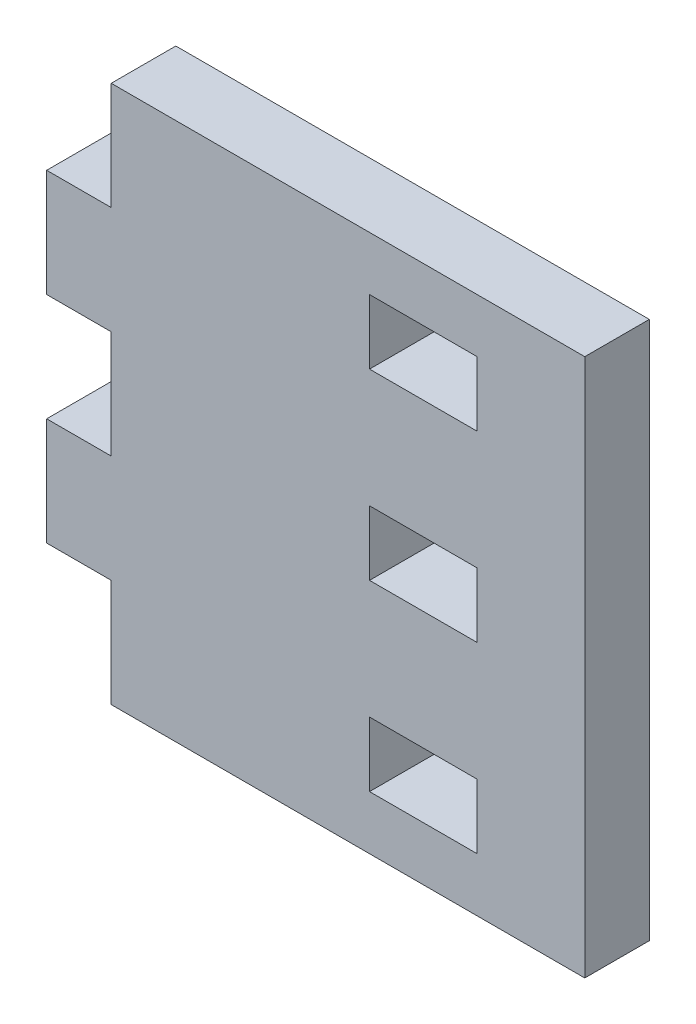
ISO-10303-21;
HEADER;
FILE_DESCRIPTION(('STEP AP214'),'2;1');
FILE_NAME('part.step','',(''),(''),'','','');
FILE_SCHEMA(('AUTOMOTIVE_DESIGN { 1 0 10303 214 1 1 1 1 }'));
ENDSEC;
DATA;
#1=APPLICATION_CONTEXT('core data for automotive mechanical design processes');
#2=APPLICATION_PROTOCOL_DEFINITION('international standard','automotive_design',2000,#1);
#3=PRODUCT_CONTEXT('',#1,'mechanical');
#4=PRODUCT('Part','Part','',(#3));
#5=PRODUCT_RELATED_PRODUCT_CATEGORY('part','',(#4));
#6=PRODUCT_DEFINITION_FORMATION('','',#4);
#7=PRODUCT_DEFINITION_CONTEXT('part definition',#1,'design');
#8=PRODUCT_DEFINITION('design','',#6,#7);
#9=PRODUCT_DEFINITION_SHAPE('','',#8);
#10=(LENGTH_UNIT() NAMED_UNIT(*) SI_UNIT(.MILLI.,.METRE.));
#11=(NAMED_UNIT(*) PLANE_ANGLE_UNIT() SI_UNIT($,.RADIAN.));
#12=(NAMED_UNIT(*) SI_UNIT($,.STERADIAN.) SOLID_ANGLE_UNIT());
#13=UNCERTAINTY_MEASURE_WITH_UNIT(LENGTH_MEASURE(1.E-05),#10,'distance_accuracy_value','');
#14=(GEOMETRIC_REPRESENTATION_CONTEXT(3) GLOBAL_UNCERTAINTY_ASSIGNED_CONTEXT((#13)) GLOBAL_UNIT_ASSIGNED_CONTEXT((#10,
#11,#12)) REPRESENTATION_CONTEXT('',''));
#15=CARTESIAN_POINT('',(0.,0.,0.));
#16=DIRECTION('',(0.,0.,1.));
#17=DIRECTION('',(1.,0.,0.));
#18=AXIS2_PLACEMENT_3D('',#15,#16,#17);
#19=CARTESIAN_POINT('',(0.,23.7375,6.));
#20=DIRECTION('',(0.,1.,0.));
#21=DIRECTION('',(0.,0.,1.));
#22=AXIS2_PLACEMENT_3D('',#19,#20,#21);
#23=PLANE('',#22);
#24=DIRECTION('',(1.,0.,0.));
#25=VECTOR('',#24,1.);
#26=CARTESIAN_POINT('',(0.,23.7375,0.));
#27=LINE('',#26,#25);
#28=CARTESIAN_POINT('',(-3.44999999999998,23.7375,0.));
#29=VERTEX_POINT('',#28);
#30=CARTESIAN_POINT('',(6.55000000000002,23.7375,0.));
#31=VERTEX_POINT('',#30);
#32=EDGE_CURVE('E281',#29,#31,#27,.T.);
#33=ORIENTED_EDGE('',*,*,#32,.T.);
#34=DIRECTION('',(0.,0.,-1.));
#35=VECTOR('',#34,1.);
#36=CARTESIAN_POINT('',(6.55000000000002,23.7375,6.));
#37=LINE('',#36,#35);
#38=CARTESIAN_POINT('',(6.55000000000002,23.7375,6.));
#39=VERTEX_POINT('',#38);
#40=EDGE_CURVE('E11',#39,#31,#37,.T.);
#41=ORIENTED_EDGE('',*,*,#40,.F.);
#42=DIRECTION('',(1.,0.,0.));
#43=VECTOR('',#42,1.);
#44=CARTESIAN_POINT('',(0.,23.7375,6.));
#45=LINE('',#44,#43);
#46=CARTESIAN_POINT('',(-3.44999999999998,23.7375,6.));
#47=VERTEX_POINT('',#46);
#48=EDGE_CURVE('E210',#47,#39,#45,.T.);
#49=ORIENTED_EDGE('',*,*,#48,.F.);
#50=DIRECTION('',(0.,0.,-1.));
#51=VECTOR('',#50,1.);
#52=CARTESIAN_POINT('',(-3.44999999999998,23.7375,6.));
#53=LINE('',#52,#51);
#54=EDGE_CURVE('E54',#47,#29,#53,.T.);
#55=ORIENTED_EDGE('',*,*,#54,.T.);
#56=EDGE_LOOP('',(#33,#41,#49,#55));
#57=FACE_BOUND('',#56,.T.);
#58=ADVANCED_FACE('F35',(#57),#23,.F.);
#59=CARTESIAN_POINT('',(6.55000000000002,0.,6.));
#60=DIRECTION('',(1.,0.,0.));
#61=DIRECTION('',(0.,1.,0.));
#62=AXIS2_PLACEMENT_3D('',#59,#60,#61);
#63=PLANE('',#62);
#64=DIRECTION('',(0.,-1.,0.));
#65=VECTOR('',#64,1.);
#66=CARTESIAN_POINT('',(6.55000000000002,0.,0.));
#67=LINE('',#66,#65);
#68=CARTESIAN_POINT('',(6.55000000000002,17.7374999999999,0.));
#69=VERTEX_POINT('',#68);
#70=EDGE_CURVE('E216',#31,#69,#67,.T.);
#71=ORIENTED_EDGE('',*,*,#70,.T.);
#72=DIRECTION('',(0.,0.,-1.));
#73=VECTOR('',#72,1.);
#74=CARTESIAN_POINT('',(6.55000000000002,17.7374999999999,6.));
#75=LINE('',#74,#73);
#76=CARTESIAN_POINT('',(6.55000000000002,17.7374999999999,6.));
#77=VERTEX_POINT('',#76);
#78=EDGE_CURVE('E45',#77,#69,#75,.T.);
#79=ORIENTED_EDGE('',*,*,#78,.F.);
#80=DIRECTION('',(0.,-1.,0.));
#81=VECTOR('',#80,1.);
#82=CARTESIAN_POINT('',(6.55000000000002,0.,6.));
#83=LINE('',#82,#81);
#84=EDGE_CURVE('E204',#39,#77,#83,.T.);
#85=ORIENTED_EDGE('',*,*,#84,.F.);
#86=ORIENTED_EDGE('',*,*,#40,.T.);
#87=EDGE_LOOP('',(#71,#79,#85,#86));
#88=FACE_BOUND('',#87,.T.);
#89=ADVANCED_FACE('F215',(#88),#63,.F.);
#90=CARTESIAN_POINT('',(0.,17.7374999999999,6.));
#91=DIRECTION('',(0.,1.,0.));
#92=DIRECTION('',(0.,0.,1.));
#93=AXIS2_PLACEMENT_3D('',#90,#91,#92);
#94=PLANE('',#93);
#95=DIRECTION('',(1.,0.,0.));
#96=VECTOR('',#95,1.);
#97=CARTESIAN_POINT('',(0.,17.7374999999999,0.));
#98=LINE('',#97,#96);
#99=CARTESIAN_POINT('',(-3.44999999999998,17.7374999999999,0.));
#100=VERTEX_POINT('',#99);
#101=EDGE_CURVE('E284',#100,#69,#98,.T.);
#102=ORIENTED_EDGE('',*,*,#101,.F.);
#103=DIRECTION('',(0.,0.,-1.));
#104=VECTOR('',#103,1.);
#105=CARTESIAN_POINT('',(-3.44999999999998,17.7374999999999,6.));
#106=LINE('',#105,#104);
#107=CARTESIAN_POINT('',(-3.44999999999998,17.7374999999999,6.));
#108=VERTEX_POINT('',#107);
#109=EDGE_CURVE('E128',#108,#100,#106,.T.);
#110=ORIENTED_EDGE('',*,*,#109,.F.);
#111=DIRECTION('',(1.,0.,0.));
#112=VECTOR('',#111,1.);
#113=CARTESIAN_POINT('',(0.,17.7374999999999,6.));
#114=LINE('',#113,#112);
#115=EDGE_CURVE('E209',#108,#77,#114,.T.);
#116=ORIENTED_EDGE('',*,*,#115,.T.);
#117=ORIENTED_EDGE('',*,*,#78,.T.);
#118=EDGE_LOOP('',(#102,#110,#116,#117));
#119=FACE_BOUND('',#118,.T.);
#120=ADVANCED_FACE('F220',(#119),#94,.T.);
#121=CARTESIAN_POINT('',(0.,-11.2625000000001,6.));
#122=DIRECTION('',(0.,1.,0.));
#123=DIRECTION('',(0.,0.,1.));
#124=AXIS2_PLACEMENT_3D('',#121,#122,#123);
#125=PLANE('',#124);
#126=DIRECTION('',(1.,0.,0.));
#127=VECTOR('',#126,1.);
#128=CARTESIAN_POINT('',(0.,-11.2625000000001,0.));
#129=LINE('',#128,#127);
#130=CARTESIAN_POINT('',(-33.45,-11.2625000000001,0.));
#131=VERTEX_POINT('',#130);
#132=CARTESIAN_POINT('',(-27.4499999999994,-11.2625000000001,0.));
#133=VERTEX_POINT('',#132);
#134=EDGE_CURVE('E250',#131,#133,#129,.T.);
#135=ORIENTED_EDGE('',*,*,#134,.T.);
#136=DIRECTION('',(0.,0.,-1.));
#137=VECTOR('',#136,1.);
#138=CARTESIAN_POINT('',(-27.4499999999994,-11.2625000000001,6.));
#139=LINE('',#138,#137);
#140=CARTESIAN_POINT('',(-27.4499999999994,-11.2625000000001,6.));
#141=VERTEX_POINT('',#140);
#142=EDGE_CURVE('E291',#141,#133,#139,.T.);
#143=ORIENTED_EDGE('',*,*,#142,.F.);
#144=DIRECTION('',(1.,0.,0.));
#145=VECTOR('',#144,1.);
#146=CARTESIAN_POINT('',(0.,-11.2625000000001,6.));
#147=LINE('',#146,#145);
#148=CARTESIAN_POINT('',(-33.45,-11.2625000000001,6.));
#149=VERTEX_POINT('',#148);
#150=EDGE_CURVE('E371',#149,#141,#147,.T.);
#151=ORIENTED_EDGE('',*,*,#150,.F.);
#152=DIRECTION('',(0.,0.,-1.));
#153=VECTOR('',#152,1.);
#154=CARTESIAN_POINT('',(-33.45,-11.2625000000001,6.));
#155=LINE('',#154,#153);
#156=EDGE_CURVE('E293',#149,#131,#155,.T.);
#157=ORIENTED_EDGE('',*,*,#156,.T.);
#158=EDGE_LOOP('',(#135,#143,#151,#157));
#159=FACE_BOUND('',#158,.T.);
#160=ADVANCED_FACE('F409',(#159),#125,.F.);
#161=CARTESIAN_POINT('',(-27.4499999999994,0.,6.));
#162=DIRECTION('',(1.,0.,0.));
#163=DIRECTION('',(0.,0.,-1.));
#164=AXIS2_PLACEMENT_3D('',#161,#162,#163);
#165=PLANE('',#164);
#166=DIRECTION('',(0.,-1.,0.));
#167=VECTOR('',#166,1.);
#168=CARTESIAN_POINT('',(-27.4499999999994,0.,0.));
#169=LINE('',#168,#167);
#170=CARTESIAN_POINT('',(-27.4499999999994,-21.2625000000001,0.));
#171=VERTEX_POINT('',#170);
#172=EDGE_CURVE('E253',#133,#171,#169,.T.);
#173=ORIENTED_EDGE('',*,*,#172,.T.);
#174=DIRECTION('',(0.,0.,-1.));
#175=VECTOR('',#174,1.);
#176=CARTESIAN_POINT('',(-27.4499999999994,-21.2625000000001,6.));
#177=LINE('',#176,#175);
#178=CARTESIAN_POINT('',(-27.4499999999994,-21.2625000000001,6.));
#179=VERTEX_POINT('',#178);
#180=EDGE_CURVE('E317',#179,#171,#177,.T.);
#181=ORIENTED_EDGE('',*,*,#180,.F.);
#182=DIRECTION('',(0.,-1.,0.));
#183=VECTOR('',#182,1.);
#184=CARTESIAN_POINT('',(-27.4499999999994,0.,6.));
#185=LINE('',#184,#183);
#186=EDGE_CURVE('E374',#141,#179,#185,.T.);
#187=ORIENTED_EDGE('',*,*,#186,.F.);
#188=ORIENTED_EDGE('',*,*,#142,.T.);
#189=EDGE_LOOP('',(#173,#181,#187,#188));
#190=FACE_BOUND('',#189,.T.);
#191=ADVANCED_FACE('F411',(#190),#165,.F.);
#192=CARTESIAN_POINT('',(0.,-21.2625000000001,6.));
#193=DIRECTION('',(0.,1.,0.));
#194=DIRECTION('',(-1.,0.,0.));
#195=AXIS2_PLACEMENT_3D('',#192,#193,#194);
#196=PLANE('',#195);
#197=DIRECTION('',(1.,0.,0.));
#198=VECTOR('',#197,1.);
#199=CARTESIAN_POINT('',(0.,-21.2625000000001,0.));
#200=LINE('',#199,#198);
#201=CARTESIAN_POINT('',(16.55,-21.2625000000001,0.));
#202=VERTEX_POINT('',#201);
#203=EDGE_CURVE('E255',#171,#202,#200,.T.);
#204=ORIENTED_EDGE('',*,*,#203,.T.);
#205=DIRECTION('',(0.,0.,-1.));
#206=VECTOR('',#205,1.);
#207=CARTESIAN_POINT('',(16.55,-21.2625000000001,6.));
#208=LINE('',#207,#206);
#209=CARTESIAN_POINT('',(16.55,-21.2625000000001,6.));
#210=VERTEX_POINT('',#209);
#211=EDGE_CURVE('E315',#210,#202,#208,.T.);
#212=ORIENTED_EDGE('',*,*,#211,.F.);
#213=DIRECTION('',(1.,0.,0.));
#214=VECTOR('',#213,1.);
#215=CARTESIAN_POINT('',(0.,-21.2625000000001,6.));
#216=LINE('',#215,#214);
#217=EDGE_CURVE('E376',#179,#210,#216,.T.);
#218=ORIENTED_EDGE('',*,*,#217,.F.);
#219=ORIENTED_EDGE('',*,*,#180,.T.);
#220=EDGE_LOOP('',(#204,#212,#218,#219));
#221=FACE_BOUND('',#220,.T.);
#222=ADVANCED_FACE('F418',(#221),#196,.F.);
#223=CARTESIAN_POINT('',(16.55,0.,6.));
#224=DIRECTION('',(1.,0.,0.));
#225=DIRECTION('',(0.,1.,0.));
#226=AXIS2_PLACEMENT_3D('',#223,#224,#225);
#227=PLANE('',#226);
#228=DIRECTION('',(0.,-1.,0.));
#229=VECTOR('',#228,1.);
#230=CARTESIAN_POINT('',(16.55,0.,0.));
#231=LINE('',#230,#229);
#232=CARTESIAN_POINT('',(16.55,28.7374999999999,0.));
#233=VERTEX_POINT('',#232);
#234=EDGE_CURVE('E258',#233,#202,#231,.T.);
#235=ORIENTED_EDGE('',*,*,#234,.F.);
#236=DIRECTION('',(0.,0.,-1.));
#237=VECTOR('',#236,1.);
#238=CARTESIAN_POINT('',(16.55,28.7374999999999,6.));
#239=LINE('',#238,#237);
#240=CARTESIAN_POINT('',(16.55,28.7374999999999,6.));
#241=VERTEX_POINT('',#240);
#242=EDGE_CURVE('E313',#241,#233,#239,.T.);
#243=ORIENTED_EDGE('',*,*,#242,.F.);
#244=DIRECTION('',(0.,-1.,0.));
#245=VECTOR('',#244,1.);
#246=CARTESIAN_POINT('',(16.55,0.,6.));
#247=LINE('',#246,#245);
#248=EDGE_CURVE('E378',#241,#210,#247,.T.);
#249=ORIENTED_EDGE('',*,*,#248,.T.);
#250=ORIENTED_EDGE('',*,*,#211,.T.);
#251=EDGE_LOOP('',(#235,#243,#249,#250));
#252=FACE_BOUND('',#251,.T.);
#253=ADVANCED_FACE('F422',(#252),#227,.T.);
#254=CARTESIAN_POINT('',(0.,28.7374999999999,6.));
#255=DIRECTION('',(0.,1.,0.));
#256=DIRECTION('',(0.,0.,1.));
#257=AXIS2_PLACEMENT_3D('',#254,#255,#256);
#258=PLANE('',#257);
#259=DIRECTION('',(1.,0.,0.));
#260=VECTOR('',#259,1.);
#261=CARTESIAN_POINT('',(0.,28.7374999999999,0.));
#262=LINE('',#261,#260);
#263=CARTESIAN_POINT('',(-27.45,28.7374999999999,0.));
#264=VERTEX_POINT('',#263);
#265=EDGE_CURVE('E261',#264,#233,#262,.T.);
#266=ORIENTED_EDGE('',*,*,#265,.F.);
#267=DIRECTION('',(0.,0.,-1.));
#268=VECTOR('',#267,1.);
#269=CARTESIAN_POINT('',(-27.45,28.7374999999999,6.));
#270=LINE('',#269,#268);
#271=CARTESIAN_POINT('',(-27.45,28.7374999999999,6.));
#272=VERTEX_POINT('',#271);
#273=EDGE_CURVE('E311',#272,#264,#270,.T.);
#274=ORIENTED_EDGE('',*,*,#273,.F.);
#275=DIRECTION('',(1.,0.,0.));
#276=VECTOR('',#275,1.);
#277=CARTESIAN_POINT('',(0.,28.7374999999999,6.));
#278=LINE('',#277,#276);
#279=EDGE_CURVE('E381',#272,#241,#278,.T.);
#280=ORIENTED_EDGE('',*,*,#279,.T.);
#281=ORIENTED_EDGE('',*,*,#242,.T.);
#282=EDGE_LOOP('',(#266,#274,#280,#281));
#283=FACE_BOUND('',#282,.T.);
#284=ADVANCED_FACE('F425',(#283),#258,.T.);
#285=CARTESIAN_POINT('',(-27.45,0.,6.));
#286=DIRECTION('',(1.,0.,0.));
#287=DIRECTION('',(0.,0.,-1.));
#288=AXIS2_PLACEMENT_3D('',#285,#286,#287);
#289=PLANE('',#288);
#290=DIRECTION('',(0.,-1.,0.));
#291=VECTOR('',#290,1.);
#292=CARTESIAN_POINT('',(-27.45,0.,0.));
#293=LINE('',#292,#291);
#294=CARTESIAN_POINT('',(-27.45,18.7374999999999,0.));
#295=VERTEX_POINT('',#294);
#296=EDGE_CURVE('E264',#264,#295,#293,.T.);
#297=ORIENTED_EDGE('',*,*,#296,.T.);
#298=DIRECTION('',(0.,0.,-1.));
#299=VECTOR('',#298,1.);
#300=CARTESIAN_POINT('',(-27.45,18.7374999999999,6.));
#301=LINE('',#300,#299);
#302=CARTESIAN_POINT('',(-27.45,18.7374999999999,6.));
#303=VERTEX_POINT('',#302);
#304=EDGE_CURVE('E309',#303,#295,#301,.T.);
#305=ORIENTED_EDGE('',*,*,#304,.F.);
#306=DIRECTION('',(0.,-1.,0.));
#307=VECTOR('',#306,1.);
#308=CARTESIAN_POINT('',(-27.45,0.,6.));
#309=LINE('',#308,#307);
#310=EDGE_CURVE('E384',#272,#303,#309,.T.);
#311=ORIENTED_EDGE('',*,*,#310,.F.);
#312=ORIENTED_EDGE('',*,*,#273,.T.);
#313=EDGE_LOOP('',(#297,#305,#311,#312));
#314=FACE_BOUND('',#313,.T.);
#315=ADVANCED_FACE('F430',(#314),#289,.F.);
#316=CARTESIAN_POINT('',(0.,18.7374999999999,6.));
#317=DIRECTION('',(0.,1.,0.));
#318=DIRECTION('',(0.,0.,1.));
#319=AXIS2_PLACEMENT_3D('',#316,#317,#318);
#320=PLANE('',#319);
#321=DIRECTION('',(1.,0.,0.));
#322=VECTOR('',#321,1.);
#323=CARTESIAN_POINT('',(0.,18.7374999999999,0.));
#324=LINE('',#323,#322);
#325=CARTESIAN_POINT('',(-33.45,18.7374999999999,0.));
#326=VERTEX_POINT('',#325);
#327=EDGE_CURVE('E267',#326,#295,#324,.T.);
#328=ORIENTED_EDGE('',*,*,#327,.F.);
#329=DIRECTION('',(0.,0.,-1.));
#330=VECTOR('',#329,1.);
#331=CARTESIAN_POINT('',(-33.45,18.7374999999999,6.));
#332=LINE('',#331,#330);
#333=CARTESIAN_POINT('',(-33.45,18.7374999999999,6.));
#334=VERTEX_POINT('',#333);
#335=EDGE_CURVE('E307',#334,#326,#332,.T.);
#336=ORIENTED_EDGE('',*,*,#335,.F.);
#337=DIRECTION('',(1.,0.,0.));
#338=VECTOR('',#337,1.);
#339=CARTESIAN_POINT('',(0.,18.7374999999999,6.));
#340=LINE('',#339,#338);
#341=EDGE_CURVE('E386',#334,#303,#340,.T.);
#342=ORIENTED_EDGE('',*,*,#341,.T.);
#343=ORIENTED_EDGE('',*,*,#304,.T.);
#344=EDGE_LOOP('',(#328,#336,#342,#343));
#345=FACE_BOUND('',#344,.T.);
#346=ADVANCED_FACE('F434',(#345),#320,.T.);
#347=CARTESIAN_POINT('',(-33.45,0.,6.));
#348=DIRECTION('',(1.,0.,0.));
#349=DIRECTION('',(0.,1.,0.));
#350=AXIS2_PLACEMENT_3D('',#347,#348,#349);
#351=PLANE('',#350);
#352=DIRECTION('',(0.,-1.,0.));
#353=VECTOR('',#352,1.);
#354=CARTESIAN_POINT('',(-33.45,0.,0.));
#355=LINE('',#354,#353);
#356=CARTESIAN_POINT('',(-33.4499999999997,8.73749999999995,0.));
#357=VERTEX_POINT('',#356);
#358=EDGE_CURVE('E270',#326,#357,#355,.T.);
#359=ORIENTED_EDGE('',*,*,#358,.T.);
#360=DIRECTION('',(0.,0.,-1.));
#361=VECTOR('',#360,1.);
#362=CARTESIAN_POINT('',(-33.4499999999997,8.73749999999995,6.));
#363=LINE('',#362,#361);
#364=CARTESIAN_POINT('',(-33.4499999999997,8.73749999999995,6.));
#365=VERTEX_POINT('',#364);
#366=EDGE_CURVE('E304',#365,#357,#363,.T.);
#367=ORIENTED_EDGE('',*,*,#366,.F.);
#368=DIRECTION('',(0.,-1.,0.));
#369=VECTOR('',#368,1.);
#370=CARTESIAN_POINT('',(-33.45,0.,6.));
#371=LINE('',#370,#369);
#372=EDGE_CURVE('E389',#334,#365,#371,.T.);
#373=ORIENTED_EDGE('',*,*,#372,.F.);
#374=ORIENTED_EDGE('',*,*,#335,.T.);
#375=EDGE_LOOP('',(#359,#367,#373,#374));
#376=FACE_BOUND('',#375,.T.);
#377=ADVANCED_FACE('F439',(#376),#351,.F.);
#378=CARTESIAN_POINT('',(0.,8.73749999999995,6.));
#379=DIRECTION('',(0.,1.,0.));
#380=DIRECTION('',(0.,0.,1.));
#381=AXIS2_PLACEMENT_3D('',#378,#379,#380);
#382=PLANE('',#381);
#383=DIRECTION('',(1.,0.,0.));
#384=VECTOR('',#383,1.);
#385=CARTESIAN_POINT('',(0.,8.73749999999995,0.));
#386=LINE('',#385,#384);
#387=CARTESIAN_POINT('',(-27.4499999999997,8.73749999999995,0.));
#388=VERTEX_POINT('',#387);
#389=EDGE_CURVE('E272',#357,#388,#386,.T.);
#390=ORIENTED_EDGE('',*,*,#389,.T.);
#391=DIRECTION('',(0.,0.,-1.));
#392=VECTOR('',#391,1.);
#393=CARTESIAN_POINT('',(-27.4499999999997,8.73749999999995,6.));
#394=LINE('',#393,#392);
#395=CARTESIAN_POINT('',(-27.4499999999997,8.73749999999995,6.));
#396=VERTEX_POINT('',#395);
#397=EDGE_CURVE('E301',#396,#388,#394,.T.);
#398=ORIENTED_EDGE('',*,*,#397,.F.);
#399=DIRECTION('',(1.,0.,0.));
#400=VECTOR('',#399,1.);
#401=CARTESIAN_POINT('',(0.,8.73749999999995,6.));
#402=LINE('',#401,#400);
#403=EDGE_CURVE('E391',#365,#396,#402,.T.);
#404=ORIENTED_EDGE('',*,*,#403,.F.);
#405=ORIENTED_EDGE('',*,*,#366,.T.);
#406=EDGE_LOOP('',(#390,#398,#404,#405));
#407=FACE_BOUND('',#406,.T.);
#408=ADVANCED_FACE('F445',(#407),#382,.F.);
#409=CARTESIAN_POINT('',(-27.4499999999997,0.,6.));
#410=DIRECTION('',(1.,0.,0.));
#411=DIRECTION('',(0.,0.,-1.));
#412=AXIS2_PLACEMENT_3D('',#409,#410,#411);
#413=PLANE('',#412);
#414=DIRECTION('',(0.,-1.,0.));
#415=VECTOR('',#414,1.);
#416=CARTESIAN_POINT('',(-27.4499999999997,0.,0.));
#417=LINE('',#416,#415);
#418=CARTESIAN_POINT('',(-27.4499999999997,-1.26250000000005,0.));
#419=VERTEX_POINT('',#418);
#420=EDGE_CURVE('E275',#388,#419,#417,.T.);
#421=ORIENTED_EDGE('',*,*,#420,.T.);
#422=DIRECTION('',(0.,0.,-1.));
#423=VECTOR('',#422,1.);
#424=CARTESIAN_POINT('',(-27.4499999999997,-1.26250000000005,6.));
#425=LINE('',#424,#423);
#426=CARTESIAN_POINT('',(-27.4499999999997,-1.26250000000005,6.));
#427=VERTEX_POINT('',#426);
#428=EDGE_CURVE('E299',#427,#419,#425,.T.);
#429=ORIENTED_EDGE('',*,*,#428,.F.);
#430=DIRECTION('',(0.,-1.,0.));
#431=VECTOR('',#430,1.);
#432=CARTESIAN_POINT('',(-27.4499999999997,0.,6.));
#433=LINE('',#432,#431);
#434=EDGE_CURVE('E394',#396,#427,#433,.T.);
#435=ORIENTED_EDGE('',*,*,#434,.F.);
#436=ORIENTED_EDGE('',*,*,#397,.T.);
#437=EDGE_LOOP('',(#421,#429,#435,#436));
#438=FACE_BOUND('',#437,.T.);
#439=ADVANCED_FACE('F449',(#438),#413,.F.);
#440=CARTESIAN_POINT('',(0.,-1.26250000000005,6.));
#441=DIRECTION('',(0.,1.,0.));
#442=DIRECTION('',(0.,0.,1.));
#443=AXIS2_PLACEMENT_3D('',#440,#441,#442);
#444=PLANE('',#443);
#445=DIRECTION('',(1.,0.,0.));
#446=VECTOR('',#445,1.);
#447=CARTESIAN_POINT('',(0.,-1.26250000000005,0.));
#448=LINE('',#447,#446);
#449=CARTESIAN_POINT('',(-33.4499999999997,-1.26250000000005,0.));
#450=VERTEX_POINT('',#449);
#451=EDGE_CURVE('E278',#450,#419,#448,.T.);
#452=ORIENTED_EDGE('',*,*,#451,.F.);
#453=DIRECTION('',(0.,0.,-1.));
#454=VECTOR('',#453,1.);
#455=CARTESIAN_POINT('',(-33.4499999999997,-1.26250000000005,6.));
#456=LINE('',#455,#454);
#457=CARTESIAN_POINT('',(-33.4499999999997,-1.26250000000005,6.));
#458=VERTEX_POINT('',#457);
#459=EDGE_CURVE('E296',#458,#450,#456,.T.);
#460=ORIENTED_EDGE('',*,*,#459,.F.);
#461=DIRECTION('',(1.,0.,0.));
#462=VECTOR('',#461,1.);
#463=CARTESIAN_POINT('',(0.,-1.26250000000005,6.));
#464=LINE('',#463,#462);
#465=EDGE_CURVE('E396',#458,#427,#464,.T.);
#466=ORIENTED_EDGE('',*,*,#465,.T.);
#467=ORIENTED_EDGE('',*,*,#428,.T.);
#468=EDGE_LOOP('',(#452,#460,#466,#467));
#469=FACE_BOUND('',#468,.T.);
#470=ADVANCED_FACE('F452',(#469),#444,.T.);
#471=CARTESIAN_POINT('',(0.,0.737499999999947,6.));
#472=DIRECTION('',(0.,1.,0.));
#473=DIRECTION('',(0.,0.,1.));
#474=AXIS2_PLACEMENT_3D('',#471,#472,#473);
#475=PLANE('',#474);
#476=DIRECTION('',(1.,0.,0.));
#477=VECTOR('',#476,1.);
#478=CARTESIAN_POINT('',(0.,0.737499999999947,0.));
#479=LINE('',#478,#477);
#480=CARTESIAN_POINT('',(-3.44999999999974,0.737499999999947,0.));
#481=VERTEX_POINT('',#480);
#482=CARTESIAN_POINT('',(6.55000000000026,0.737499999999947,0.));
#483=VERTEX_POINT('',#482);
#484=EDGE_CURVE('E238',#481,#483,#479,.T.);
#485=ORIENTED_EDGE('',*,*,#484,.F.);
#486=DIRECTION('',(0.,0.,-1.));
#487=VECTOR('',#486,1.);
#488=CARTESIAN_POINT('',(-3.44999999999974,0.737499999999947,6.));
#489=LINE('',#488,#487);
#490=CARTESIAN_POINT('',(-3.44999999999974,0.737499999999947,6.));
#491=VERTEX_POINT('',#490);
#492=EDGE_CURVE('E297',#491,#481,#489,.T.);
#493=ORIENTED_EDGE('',*,*,#492,.F.);
#494=DIRECTION('',(1.,0.,0.));
#495=VECTOR('',#494,1.);
#496=CARTESIAN_POINT('',(0.,0.737499999999947,6.));
#497=LINE('',#496,#495);
#498=CARTESIAN_POINT('',(6.55000000000026,0.737499999999947,6.));
#499=VERTEX_POINT('',#498);
#500=EDGE_CURVE('E355',#491,#499,#497,.T.);
#501=ORIENTED_EDGE('',*,*,#500,.T.);
#502=DIRECTION('',(0.,0.,-1.));
#503=VECTOR('',#502,1.);
#504=CARTESIAN_POINT('',(6.55000000000026,0.737499999999947,6.));
#505=LINE('',#504,#503);
#506=EDGE_CURVE('E322',#499,#483,#505,.T.);
#507=ORIENTED_EDGE('',*,*,#506,.T.);
#508=EDGE_LOOP('',(#485,#493,#501,#507));
#509=FACE_BOUND('',#508,.T.);
#510=ADVANCED_FACE('F479',(#509),#475,.T.);
#511=CARTESIAN_POINT('',(-3.44999999999974,0.,6.));
#512=DIRECTION('',(1.,0.,0.));
#513=DIRECTION('',(0.,1.,0.));
#514=AXIS2_PLACEMENT_3D('',#511,#512,#513);
#515=PLANE('',#514);
#516=DIRECTION('',(0.,-1.,0.));
#517=VECTOR('',#516,1.);
#518=CARTESIAN_POINT('',(-3.44999999999974,0.,0.));
#519=LINE('',#518,#517);
#520=CARTESIAN_POINT('',(-3.44999999999974,6.73749999999994,0.));
#521=VERTEX_POINT('',#520);
#522=EDGE_CURVE('E241',#521,#481,#519,.T.);
#523=ORIENTED_EDGE('',*,*,#522,.F.);
#524=DIRECTION('',(0.,0.,-1.));
#525=VECTOR('',#524,1.);
#526=CARTESIAN_POINT('',(-3.44999999999974,6.73749999999994,6.));
#527=LINE('',#526,#525);
#528=CARTESIAN_POINT('',(-3.44999999999974,6.73749999999994,6.));
#529=VERTEX_POINT('',#528);
#530=EDGE_CURVE('E327',#529,#521,#527,.T.);
#531=ORIENTED_EDGE('',*,*,#530,.F.);
#532=DIRECTION('',(0.,-1.,0.));
#533=VECTOR('',#532,1.);
#534=CARTESIAN_POINT('',(-3.44999999999974,0.,6.));
#535=LINE('',#534,#533);
#536=EDGE_CURVE('E359',#529,#491,#535,.T.);
#537=ORIENTED_EDGE('',*,*,#536,.T.);
#538=ORIENTED_EDGE('',*,*,#492,.T.);
#539=EDGE_LOOP('',(#523,#531,#537,#538));
#540=FACE_BOUND('',#539,.T.);
#541=ADVANCED_FACE('F504',(#540),#515,.T.);
#542=CARTESIAN_POINT('',(0.,6.73749999999995,6.));
#543=DIRECTION('',(0.,1.,0.));
#544=DIRECTION('',(-1.,0.,0.));
#545=AXIS2_PLACEMENT_3D('',#542,#543,#544);
#546=PLANE('',#545);
#547=DIRECTION('',(1.,0.,0.));
#548=VECTOR('',#547,1.);
#549=CARTESIAN_POINT('',(0.,6.73749999999995,0.));
#550=LINE('',#549,#548);
#551=CARTESIAN_POINT('',(6.55000000000026,6.73749999999995,0.));
#552=VERTEX_POINT('',#551);
#553=EDGE_CURVE('E244',#521,#552,#550,.T.);
#554=ORIENTED_EDGE('',*,*,#553,.T.);
#555=DIRECTION('',(0.,0.,-1.));
#556=VECTOR('',#555,1.);
#557=CARTESIAN_POINT('',(6.55000000000026,6.73749999999995,6.));
#558=LINE('',#557,#556);
#559=CARTESIAN_POINT('',(6.55000000000026,6.73749999999995,6.));
#560=VERTEX_POINT('',#559);
#561=EDGE_CURVE('E324',#560,#552,#558,.T.);
#562=ORIENTED_EDGE('',*,*,#561,.F.);
#563=DIRECTION('',(1.,0.,0.));
#564=VECTOR('',#563,1.);
#565=CARTESIAN_POINT('',(0.,6.73749999999995,6.));
#566=LINE('',#565,#564);
#567=EDGE_CURVE('E366',#529,#560,#566,.T.);
#568=ORIENTED_EDGE('',*,*,#567,.F.);
#569=ORIENTED_EDGE('',*,*,#530,.T.);
#570=EDGE_LOOP('',(#554,#562,#568,#569));
#571=FACE_BOUND('',#570,.T.);
#572=ADVANCED_FACE('F501',(#571),#546,.F.);
#573=CARTESIAN_POINT('',(0.,-16.2625000000001,6.));
#574=DIRECTION('',(0.,1.,0.));
#575=DIRECTION('',(0.,0.,1.));
#576=AXIS2_PLACEMENT_3D('',#573,#574,#575);
#577=PLANE('',#576);
#578=DIRECTION('',(1.,0.,0.));
#579=VECTOR('',#578,1.);
#580=CARTESIAN_POINT('',(0.,-16.2625000000001,0.));
#581=LINE('',#580,#579);
#582=CARTESIAN_POINT('',(-3.4499999999995,-16.2625000000001,0.));
#583=VERTEX_POINT('',#582);
#584=CARTESIAN_POINT('',(6.5500000000005,-16.2625000000001,0.));
#585=VERTEX_POINT('',#584);
#586=EDGE_CURVE('E227',#583,#585,#581,.T.);
#587=ORIENTED_EDGE('',*,*,#586,.F.);
#588=DIRECTION('',(0.,0.,-1.));
#589=VECTOR('',#588,1.);
#590=CARTESIAN_POINT('',(-3.4499999999995,-16.2625000000001,6.));
#591=LINE('',#590,#589);
#592=CARTESIAN_POINT('',(-3.4499999999995,-16.2625000000001,6.));
#593=VERTEX_POINT('',#592);
#594=EDGE_CURVE('E39',#593,#583,#591,.T.);
#595=ORIENTED_EDGE('',*,*,#594,.F.);
#596=DIRECTION('',(1.,0.,0.));
#597=VECTOR('',#596,1.);
#598=CARTESIAN_POINT('',(0.,-16.2625000000001,6.));
#599=LINE('',#598,#597);
#600=CARTESIAN_POINT('',(6.5500000000005,-16.2625000000001,6.));
#601=VERTEX_POINT('',#600);
#602=EDGE_CURVE('E289',#593,#601,#599,.T.);
#603=ORIENTED_EDGE('',*,*,#602,.T.);
#604=DIRECTION('',(0.,0.,-1.));
#605=VECTOR('',#604,1.);
#606=CARTESIAN_POINT('',(6.5500000000005,-16.2625000000001,6.));
#607=LINE('',#606,#605);
#608=EDGE_CURVE('E223',#601,#585,#607,.T.);
#609=ORIENTED_EDGE('',*,*,#608,.T.);
#610=EDGE_LOOP('',(#587,#595,#603,#609));
#611=FACE_BOUND('',#610,.T.);
#612=ADVANCED_FACE('F37',(#611),#577,.T.);
#613=CARTESIAN_POINT('',(-3.44999999999951,0.,6.));
#614=DIRECTION('',(1.,0.,0.));
#615=DIRECTION('',(0.,1.,0.));
#616=AXIS2_PLACEMENT_3D('',#613,#614,#615);
#617=PLANE('',#616);
#618=DIRECTION('',(0.,-1.,0.));
#619=VECTOR('',#618,1.);
#620=CARTESIAN_POINT('',(-3.44999999999951,0.,0.));
#621=LINE('',#620,#619);
#622=CARTESIAN_POINT('',(-3.4499999999995,-10.2625000000001,0.));
#623=VERTEX_POINT('',#622);
#624=EDGE_CURVE('E230',#623,#583,#621,.T.);
#625=ORIENTED_EDGE('',*,*,#624,.F.);
#626=DIRECTION('',(0.,0.,-1.));
#627=VECTOR('',#626,1.);
#628=CARTESIAN_POINT('',(-3.4499999999995,-10.2625000000001,6.));
#629=LINE('',#628,#627);
#630=CARTESIAN_POINT('',(-3.4499999999995,-10.2625000000001,6.));
#631=VERTEX_POINT('',#630);
#632=EDGE_CURVE('E333',#631,#623,#629,.T.);
#633=ORIENTED_EDGE('',*,*,#632,.F.);
#634=DIRECTION('',(0.,-1.,0.));
#635=VECTOR('',#634,1.);
#636=CARTESIAN_POINT('',(-3.44999999999951,0.,6.));
#637=LINE('',#636,#635);
#638=EDGE_CURVE('E342',#631,#593,#637,.T.);
#639=ORIENTED_EDGE('',*,*,#638,.T.);
#640=ORIENTED_EDGE('',*,*,#594,.T.);
#641=EDGE_LOOP('',(#625,#633,#639,#640));
#642=FACE_BOUND('',#641,.T.);
#643=ADVANCED_FACE('F340',(#642),#617,.T.);
#644=CARTESIAN_POINT('',(0.,-10.2625000000001,6.));
#645=DIRECTION('',(0.,1.,0.));
#646=DIRECTION('',(-1.,0.,0.));
#647=AXIS2_PLACEMENT_3D('',#644,#645,#646);
#648=PLANE('',#647);
#649=DIRECTION('',(1.,0.,0.));
#650=VECTOR('',#649,1.);
#651=CARTESIAN_POINT('',(0.,-10.2625000000001,0.));
#652=LINE('',#651,#650);
#653=CARTESIAN_POINT('',(6.5500000000005,-10.2625,0.));
#654=VERTEX_POINT('',#653);
#655=EDGE_CURVE('E233',#623,#654,#652,.T.);
#656=ORIENTED_EDGE('',*,*,#655,.T.);
#657=DIRECTION('',(0.,0.,-1.));
#658=VECTOR('',#657,1.);
#659=CARTESIAN_POINT('',(6.5500000000005,-10.2625,6.));
#660=LINE('',#659,#658);
#661=CARTESIAN_POINT('',(6.5500000000005,-10.2625,6.));
#662=VERTEX_POINT('',#661);
#663=EDGE_CURVE('E331',#662,#654,#660,.T.);
#664=ORIENTED_EDGE('',*,*,#663,.F.);
#665=DIRECTION('',(1.,0.,0.));
#666=VECTOR('',#665,1.);
#667=CARTESIAN_POINT('',(0.,-10.2625000000001,6.));
#668=LINE('',#667,#666);
#669=EDGE_CURVE('E356',#631,#662,#668,.T.);
#670=ORIENTED_EDGE('',*,*,#669,.F.);
#671=ORIENTED_EDGE('',*,*,#632,.T.);
#672=EDGE_LOOP('',(#656,#664,#670,#671));
#673=FACE_BOUND('',#672,.T.);
#674=ADVANCED_FACE('F349',(#673),#648,.F.);
#675=EDGE_CURVE('E273',#450,#131,#355,.T.);
#676=ORIENTED_EDGE('',*,*,#675,.T.);
#677=ORIENTED_EDGE('',*,*,#156,.F.);
#678=EDGE_CURVE('E392',#458,#149,#371,.T.);
#679=ORIENTED_EDGE('',*,*,#678,.F.);
#680=ORIENTED_EDGE('',*,*,#459,.T.);
#681=EDGE_LOOP('',(#676,#677,#679,#680));
#682=FACE_BOUND('',#681,.T.);
#683=ADVANCED_FACE('F405',(#682),#351,.F.);
#684=CARTESIAN_POINT('',(6.55000000000026,0.,6.));
#685=DIRECTION('',(1.,0.,0.));
#686=DIRECTION('',(0.,1.,0.));
#687=AXIS2_PLACEMENT_3D('',#684,#685,#686);
#688=PLANE('',#687);
#689=DIRECTION('',(0.,-1.,0.));
#690=VECTOR('',#689,1.);
#691=CARTESIAN_POINT('',(6.55000000000026,0.,0.));
#692=LINE('',#691,#690);
#693=EDGE_CURVE('E247',#552,#483,#692,.T.);
#694=ORIENTED_EDGE('',*,*,#693,.T.);
#695=ORIENTED_EDGE('',*,*,#506,.F.);
#696=DIRECTION('',(0.,-1.,0.));
#697=VECTOR('',#696,1.);
#698=CARTESIAN_POINT('',(6.55000000000026,0.,6.));
#699=LINE('',#698,#697);
#700=EDGE_CURVE('E369',#560,#499,#699,.T.);
#701=ORIENTED_EDGE('',*,*,#700,.F.);
#702=ORIENTED_EDGE('',*,*,#561,.T.);
#703=EDGE_LOOP('',(#694,#695,#701,#702));
#704=FACE_BOUND('',#703,.T.);
#705=ADVANCED_FACE('F465',(#704),#688,.F.);
#706=CARTESIAN_POINT('',(6.55000000000049,0.,6.));
#707=DIRECTION('',(1.,0.,0.));
#708=DIRECTION('',(0.,1.,0.));
#709=AXIS2_PLACEMENT_3D('',#706,#707,#708);
#710=PLANE('',#709);
#711=DIRECTION('',(0.,-1.,0.));
#712=VECTOR('',#711,1.);
#713=CARTESIAN_POINT('',(6.55000000000049,0.,0.));
#714=LINE('',#713,#712);
#715=EDGE_CURVE('E235',#654,#585,#714,.T.);
#716=ORIENTED_EDGE('',*,*,#715,.T.);
#717=ORIENTED_EDGE('',*,*,#608,.F.);
#718=DIRECTION('',(0.,-1.,0.));
#719=VECTOR('',#718,1.);
#720=CARTESIAN_POINT('',(6.55000000000049,0.,6.));
#721=LINE('',#720,#719);
#722=EDGE_CURVE('E353',#662,#601,#721,.T.);
#723=ORIENTED_EDGE('',*,*,#722,.F.);
#724=ORIENTED_EDGE('',*,*,#663,.T.);
#725=EDGE_LOOP('',(#716,#717,#723,#724));
#726=FACE_BOUND('',#725,.T.);
#727=ADVANCED_FACE('F352',(#726),#710,.F.);
#728=CARTESIAN_POINT('',(-3.44999999999998,0.,6.));
#729=DIRECTION('',(1.,0.,0.));
#730=DIRECTION('',(0.,1.,0.));
#731=AXIS2_PLACEMENT_3D('',#728,#729,#730);
#732=PLANE('',#731);
#733=DIRECTION('',(0.,-1.,0.));
#734=VECTOR('',#733,1.);
#735=CARTESIAN_POINT('',(-3.44999999999998,0.,0.));
#736=LINE('',#735,#734);
#737=EDGE_CURVE('E286',#29,#100,#736,.T.);
#738=ORIENTED_EDGE('',*,*,#737,.F.);
#739=ORIENTED_EDGE('',*,*,#54,.F.);
#740=DIRECTION('',(0.,-1.,0.));
#741=VECTOR('',#740,1.);
#742=CARTESIAN_POINT('',(-3.44999999999998,0.,6.));
#743=LINE('',#742,#741);
#744=EDGE_CURVE('E221',#47,#108,#743,.T.);
#745=ORIENTED_EDGE('',*,*,#744,.T.);
#746=ORIENTED_EDGE('',*,*,#109,.T.);
#747=EDGE_LOOP('',(#738,#739,#745,#746));
#748=FACE_BOUND('',#747,.T.);
#749=ADVANCED_FACE('F457',(#748),#732,.T.);
#750=CARTESIAN_POINT('',(0.,0.,6.));
#751=DIRECTION('',(0.,0.,1.));
#752=DIRECTION('',(1.,0.,0.));
#753=AXIS2_PLACEMENT_3D('',#750,#751,#752);
#754=PLANE('',#753);
#755=ORIENTED_EDGE('',*,*,#602,.F.);
#756=ORIENTED_EDGE('',*,*,#638,.F.);
#757=ORIENTED_EDGE('',*,*,#669,.T.);
#758=ORIENTED_EDGE('',*,*,#722,.T.);
#759=EDGE_LOOP('',(#755,#756,#757,#758));
#760=FACE_BOUND('',#759,.T.);
#761=ORIENTED_EDGE('',*,*,#500,.F.);
#762=ORIENTED_EDGE('',*,*,#536,.F.);
#763=ORIENTED_EDGE('',*,*,#567,.T.);
#764=ORIENTED_EDGE('',*,*,#700,.T.);
#765=EDGE_LOOP('',(#761,#762,#763,#764));
#766=FACE_BOUND('',#765,.T.);
#767=ORIENTED_EDGE('',*,*,#150,.T.);
#768=ORIENTED_EDGE('',*,*,#186,.T.);
#769=ORIENTED_EDGE('',*,*,#217,.T.);
#770=ORIENTED_EDGE('',*,*,#248,.F.);
#771=ORIENTED_EDGE('',*,*,#279,.F.);
#772=ORIENTED_EDGE('',*,*,#310,.T.);
#773=ORIENTED_EDGE('',*,*,#341,.F.);
#774=ORIENTED_EDGE('',*,*,#372,.T.);
#775=ORIENTED_EDGE('',*,*,#403,.T.);
#776=ORIENTED_EDGE('',*,*,#434,.T.);
#777=ORIENTED_EDGE('',*,*,#465,.F.);
#778=ORIENTED_EDGE('',*,*,#678,.T.);
#779=EDGE_LOOP('',(#767,#768,#769,#770,#771,#772,#773,#774,#775,#776,#777,#778));
#780=FACE_BOUND('',#779,.T.);
#781=ORIENTED_EDGE('',*,*,#48,.T.);
#782=ORIENTED_EDGE('',*,*,#84,.T.);
#783=ORIENTED_EDGE('',*,*,#115,.F.);
#784=ORIENTED_EDGE('',*,*,#744,.F.);
#785=EDGE_LOOP('',(#781,#782,#783,#784));
#786=FACE_BOUND('',#785,.T.);
#787=ADVANCED_FACE('F206',(#760,#766,#780,#786),#754,.T.);
#788=CARTESIAN_POINT('',(0.,0.,0.));
#789=DIRECTION('',(0.,0.,1.));
#790=DIRECTION('',(1.,0.,0.));
#791=AXIS2_PLACEMENT_3D('',#788,#789,#790);
#792=PLANE('',#791);
#793=ORIENTED_EDGE('',*,*,#586,.T.);
#794=ORIENTED_EDGE('',*,*,#715,.F.);
#795=ORIENTED_EDGE('',*,*,#655,.F.);
#796=ORIENTED_EDGE('',*,*,#624,.T.);
#797=EDGE_LOOP('',(#793,#794,#795,#796));
#798=FACE_BOUND('',#797,.T.);
#799=ORIENTED_EDGE('',*,*,#484,.T.);
#800=ORIENTED_EDGE('',*,*,#693,.F.);
#801=ORIENTED_EDGE('',*,*,#553,.F.);
#802=ORIENTED_EDGE('',*,*,#522,.T.);
#803=EDGE_LOOP('',(#799,#800,#801,#802));
#804=FACE_BOUND('',#803,.T.);
#805=ORIENTED_EDGE('',*,*,#134,.F.);
#806=ORIENTED_EDGE('',*,*,#675,.F.);
#807=ORIENTED_EDGE('',*,*,#451,.T.);
#808=ORIENTED_EDGE('',*,*,#420,.F.);
#809=ORIENTED_EDGE('',*,*,#389,.F.);
#810=ORIENTED_EDGE('',*,*,#358,.F.);
#811=ORIENTED_EDGE('',*,*,#327,.T.);
#812=ORIENTED_EDGE('',*,*,#296,.F.);
#813=ORIENTED_EDGE('',*,*,#265,.T.);
#814=ORIENTED_EDGE('',*,*,#234,.T.);
#815=ORIENTED_EDGE('',*,*,#203,.F.);
#816=ORIENTED_EDGE('',*,*,#172,.F.);
#817=EDGE_LOOP('',(#805,#806,#807,#808,#809,#810,#811,#812,#813,#814,#815,#816));
#818=FACE_BOUND('',#817,.T.);
#819=ORIENTED_EDGE('',*,*,#32,.F.);
#820=ORIENTED_EDGE('',*,*,#737,.T.);
#821=ORIENTED_EDGE('',*,*,#101,.T.);
#822=ORIENTED_EDGE('',*,*,#70,.F.);
#823=EDGE_LOOP('',(#819,#820,#821,#822));
#824=FACE_BOUND('',#823,.T.);
#825=ADVANCED_FACE('F346',(#798,#804,#818,#824),#792,.F.);
#826=CLOSED_SHELL('',(#58,#89,#120,#160,#191,#222,#253,#284,#315,#346,#377,#408,#439,#470,#510,
#541,#572,#612,#643,#674,#683,#705,#727,#749,#787,#825));
#827=MANIFOLD_SOLID_BREP('B2',#826);
#828=ADVANCED_BREP_SHAPE_REPRESENTATION('',(#18,#827),#14);
#829=SHAPE_DEFINITION_REPRESENTATION(#9,#828);
ENDSEC;
END-ISO-10303-21;
